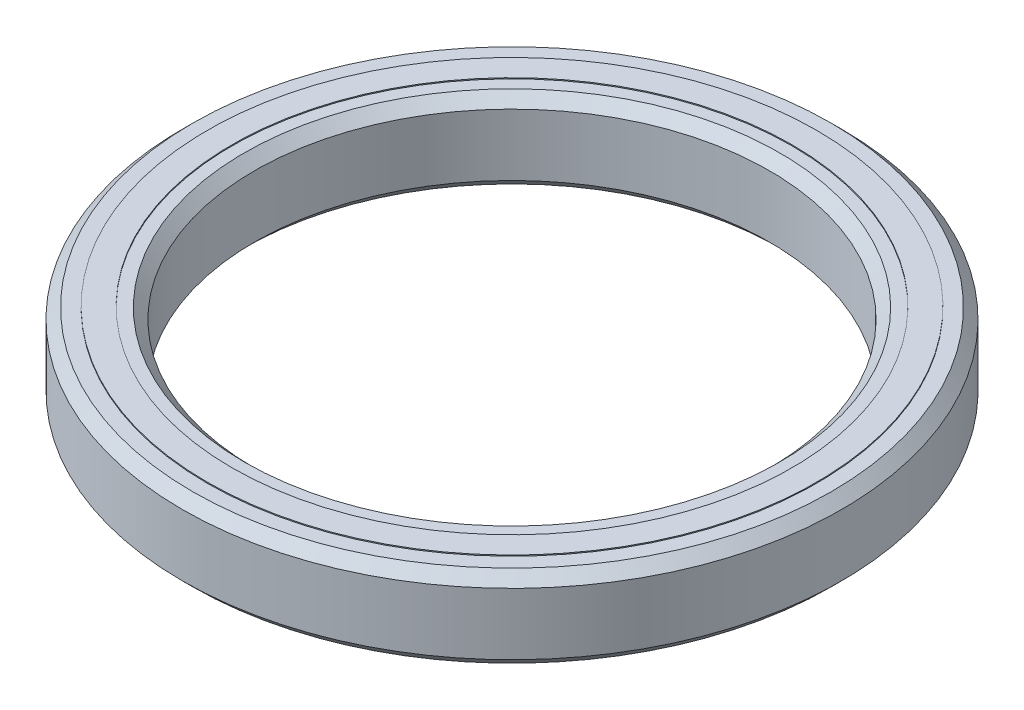
ISO-10303-21;
HEADER;
FILE_DESCRIPTION(('STEP AP214'),'2;1');
FILE_NAME('part.step','',(''),(''),'','','');
FILE_SCHEMA(('AUTOMOTIVE_DESIGN { 1 0 10303 214 1 1 1 1 }'));
ENDSEC;
DATA;
#1=APPLICATION_CONTEXT('core data for automotive mechanical design processes');
#2=APPLICATION_PROTOCOL_DEFINITION('international standard','automotive_design',2000,#1);
#3=PRODUCT_CONTEXT('',#1,'mechanical');
#4=PRODUCT('Part','Part','',(#3));
#5=PRODUCT_RELATED_PRODUCT_CATEGORY('part','',(#4));
#6=PRODUCT_DEFINITION_FORMATION('','',#4);
#7=PRODUCT_DEFINITION_CONTEXT('part definition',#1,'design');
#8=PRODUCT_DEFINITION('design','',#6,#7);
#9=PRODUCT_DEFINITION_SHAPE('','',#8);
#10=(LENGTH_UNIT() NAMED_UNIT(*) SI_UNIT(.MILLI.,.METRE.));
#11=(NAMED_UNIT(*) PLANE_ANGLE_UNIT() SI_UNIT($,.RADIAN.));
#12=(NAMED_UNIT(*) SI_UNIT($,.STERADIAN.) SOLID_ANGLE_UNIT());
#13=UNCERTAINTY_MEASURE_WITH_UNIT(LENGTH_MEASURE(1.E-05),#10,'distance_accuracy_value','');
#14=(GEOMETRIC_REPRESENTATION_CONTEXT(3) GLOBAL_UNCERTAINTY_ASSIGNED_CONTEXT((#13)) GLOBAL_UNIT_ASSIGNED_CONTEXT((#10,
#11,#12)) REPRESENTATION_CONTEXT('',''));
#15=CARTESIAN_POINT('',(0.,0.,0.));
#16=DIRECTION('',(0.,0.,1.));
#17=DIRECTION('',(1.,0.,0.));
#18=AXIS2_PLACEMENT_3D('',#15,#16,#17);
#19=CARTESIAN_POINT('',(0.,2.,0.));
#20=DIRECTION('',(0.,1.,0.));
#21=DIRECTION('',(0.,0.,1.));
#22=AXIS2_PLACEMENT_3D('',#19,#20,#21);
#23=PLANE('',#22);
#24=CARTESIAN_POINT('',(0.,2.,0.));
#25=DIRECTION('',(0.,1.,0.));
#26=DIRECTION('',(0.,0.,1.));
#27=AXIS2_PLACEMENT_3D('',#24,#25,#26);
#28=CIRCLE('',#27,14.7934604030925);
#29=CARTESIAN_POINT('',(0.,2.,14.7934604030925));
#30=VERTEX_POINT('',#29);
#31=EDGE_CURVE('E61',#30,#30,#28,.F.);
#32=ORIENTED_EDGE('',*,*,#31,.T.);
#33=EDGE_LOOP('',(#32));
#34=FACE_BOUND('',#33,.T.);
#35=CARTESIAN_POINT('',(0.,2.,0.));
#36=DIRECTION('',(0.,1.,0.));
#37=DIRECTION('',(0.,0.,1.));
#38=AXIS2_PLACEMENT_3D('',#35,#36,#37);
#39=CIRCLE('',#38,15.5);
#40=CARTESIAN_POINT('',(0.,2.,15.5));
#41=VERTEX_POINT('',#40);
#42=EDGE_CURVE('E82',#41,#41,#39,.T.);
#43=ORIENTED_EDGE('',*,*,#42,.T.);
#44=EDGE_LOOP('',(#43));
#45=FACE_BOUND('',#44,.T.);
#46=ADVANCED_FACE('F41',(#34,#45),#23,.T.);
#47=CARTESIAN_POINT('',(0.,-2.,0.));
#48=DIRECTION('',(0.,1.,0.));
#49=DIRECTION('',(0.,0.,1.));
#50=AXIS2_PLACEMENT_3D('',#47,#48,#49);
#51=PLANE('',#50);
#52=CARTESIAN_POINT('',(0.,-2.,0.));
#53=DIRECTION('',(0.,1.,0.));
#54=DIRECTION('',(0.,0.,1.));
#55=AXIS2_PLACEMENT_3D('',#52,#53,#54);
#56=CIRCLE('',#55,14.7934604030925);
#57=CARTESIAN_POINT('',(0.,-2.,14.7934604030925));
#58=VERTEX_POINT('',#57);
#59=EDGE_CURVE('E46',#58,#58,#56,.F.);
#60=ORIENTED_EDGE('',*,*,#59,.F.);
#61=EDGE_LOOP('',(#60));
#62=FACE_BOUND('',#61,.T.);
#63=CARTESIAN_POINT('',(0.,-2.,0.));
#64=DIRECTION('',(0.,1.,0.));
#65=DIRECTION('',(0.,0.,1.));
#66=AXIS2_PLACEMENT_3D('',#63,#64,#65);
#67=CIRCLE('',#66,15.5);
#68=CARTESIAN_POINT('',(0.,-2.,15.5));
#69=VERTEX_POINT('',#68);
#70=EDGE_CURVE('E65',#69,#69,#67,.F.);
#71=ORIENTED_EDGE('',*,*,#70,.T.);
#72=EDGE_LOOP('',(#71));
#73=FACE_BOUND('',#72,.T.);
#74=ADVANCED_FACE('F136',(#62,#73),#51,.F.);
#75=CARTESIAN_POINT('',(0.,2.,0.));
#76=DIRECTION('',(0.,-1.,0.));
#77=DIRECTION('',(0.,0.,-1.));
#78=AXIS2_PLACEMENT_3D('',#75,#76,#77);
#79=CYLINDRICAL_SURFACE('',#78,16.);
#80=CARTESIAN_POINT('',(0.,-1.49999999999999,0.));
#81=DIRECTION('',(0.,1.,0.));
#82=DIRECTION('',(0.,0.,1.));
#83=AXIS2_PLACEMENT_3D('',#80,#81,#82);
#84=CIRCLE('',#83,16.);
#85=CARTESIAN_POINT('',(0.,-1.49999999999999,16.));
#86=VERTEX_POINT('',#85);
#87=EDGE_CURVE('E56',#86,#86,#84,.T.);
#88=ORIENTED_EDGE('',*,*,#87,.T.);
#89=EDGE_LOOP('',(#88));
#90=FACE_BOUND('',#89,.T.);
#91=CARTESIAN_POINT('',(0.,1.49999999999999,0.));
#92=DIRECTION('',(0.,1.,0.));
#93=DIRECTION('',(0.,0.,1.));
#94=AXIS2_PLACEMENT_3D('',#91,#92,#93);
#95=CIRCLE('',#94,16.);
#96=CARTESIAN_POINT('',(0.,1.49999999999999,16.));
#97=VERTEX_POINT('',#96);
#98=EDGE_CURVE('E90',#97,#97,#95,.F.);
#99=ORIENTED_EDGE('',*,*,#98,.T.);
#100=EDGE_LOOP('',(#99));
#101=FACE_BOUND('',#100,.T.);
#102=ADVANCED_FACE('F143',(#90,#101),#79,.T.);
#103=CARTESIAN_POINT('',(0.,-1.49999999999999,0.));
#104=DIRECTION('',(0.,1.,0.));
#105=DIRECTION('',(0.,0.,1.));
#106=AXIS2_PLACEMENT_3D('',#103,#104,#105);
#107=CONICAL_SURFACE('',#106,16.,0.785398163397452);
#108=ORIENTED_EDGE('',*,*,#70,.F.);
#109=EDGE_LOOP('',(#108));
#110=FACE_BOUND('',#109,.T.);
#111=ORIENTED_EDGE('',*,*,#87,.F.);
#112=EDGE_LOOP('',(#111));
#113=FACE_BOUND('',#112,.T.);
#114=ADVANCED_FACE('F176',(#110,#113),#107,.T.);
#115=CARTESIAN_POINT('',(0.,2.,0.));
#116=DIRECTION('',(0.,-1.,0.));
#117=DIRECTION('',(0.,0.,-1.));
#118=AXIS2_PLACEMENT_3D('',#115,#116,#117);
#119=CONICAL_SURFACE('',#118,15.5,0.785398163397441);
#120=ORIENTED_EDGE('',*,*,#98,.F.);
#121=EDGE_LOOP('',(#120));
#122=FACE_BOUND('',#121,.T.);
#123=ORIENTED_EDGE('',*,*,#42,.F.);
#124=EDGE_LOOP('',(#123));
#125=FACE_BOUND('',#124,.T.);
#126=ADVANCED_FACE('F44',(#122,#125),#119,.T.);
#127=CARTESIAN_POINT('',(0.,2.05,0.));
#128=DIRECTION('',(0.,-1.,0.));
#129=DIRECTION('',(0.,0.,-1.));
#130=AXIS2_PLACEMENT_3D('',#127,#128,#129);
#131=CYLINDRICAL_SURFACE('',#130,14.7934604030925);
#132=CARTESIAN_POINT('',(0.,-2.05,0.));
#133=DIRECTION('',(0.,1.,0.));
#134=DIRECTION('',(0.,0.,1.));
#135=AXIS2_PLACEMENT_3D('',#132,#133,#134);
#136=CIRCLE('',#135,14.7934604030925);
#137=CARTESIAN_POINT('',(0.,-2.05,14.7934604030925));
#138=VERTEX_POINT('',#137);
#139=EDGE_CURVE('E59',#138,#138,#136,.T.);
#140=ORIENTED_EDGE('',*,*,#139,.T.);
#141=EDGE_LOOP('',(#140));
#142=FACE_BOUND('',#141,.T.);
#143=ORIENTED_EDGE('',*,*,#59,.T.);
#144=EDGE_LOOP('',(#143));
#145=FACE_BOUND('',#144,.T.);
#146=ADVANCED_FACE('F130',(#142,#145),#131,.T.);
#147=CARTESIAN_POINT('',(0.,-2.05,0.));
#148=DIRECTION('',(0.,1.,0.));
#149=DIRECTION('',(0.,0.,1.));
#150=AXIS2_PLACEMENT_3D('',#147,#148,#149);
#151=PLANE('',#150);
#152=ORIENTED_EDGE('',*,*,#139,.F.);
#153=EDGE_LOOP('',(#152));
#154=FACE_BOUND('',#153,.T.);
#155=CARTESIAN_POINT('',(0.,-2.05,0.));
#156=DIRECTION('',(0.,1.,0.));
#157=DIRECTION('',(0.,0.,1.));
#158=AXIS2_PLACEMENT_3D('',#155,#156,#157);
#159=CIRCLE('',#158,13.5904737587394);
#160=CARTESIAN_POINT('',(0.,-2.05,13.5904737587394));
#161=VERTEX_POINT('',#160);
#162=EDGE_CURVE('E109',#161,#161,#159,.T.);
#163=ORIENTED_EDGE('',*,*,#162,.T.);
#164=EDGE_LOOP('',(#163));
#165=FACE_BOUND('',#164,.T.);
#166=ADVANCED_FACE('F131',(#154,#165),#151,.F.);
#167=CARTESIAN_POINT('',(0.,2.05,0.));
#168=DIRECTION('',(0.,-1.,0.));
#169=DIRECTION('',(0.,0.,-1.));
#170=AXIS2_PLACEMENT_3D('',#167,#168,#169);
#171=CYLINDRICAL_SURFACE('',#170,13.5904737587394);
#172=ORIENTED_EDGE('',*,*,#162,.F.);
#173=EDGE_LOOP('',(#172));
#174=FACE_BOUND('',#173,.T.);
#175=CARTESIAN_POINT('',(0.,-2.,0.));
#176=DIRECTION('',(0.,1.,0.));
#177=DIRECTION('',(0.,0.,1.));
#178=AXIS2_PLACEMENT_3D('',#175,#176,#177);
#179=CIRCLE('',#178,13.5904737587394);
#180=CARTESIAN_POINT('',(0.,-2.,13.5904737587394));
#181=VERTEX_POINT('',#180);
#182=EDGE_CURVE('E66',#181,#181,#179,.F.);
#183=ORIENTED_EDGE('',*,*,#182,.F.);
#184=EDGE_LOOP('',(#183));
#185=FACE_BOUND('',#184,.T.);
#186=ADVANCED_FACE('F122',(#174,#185),#171,.F.);
#187=CARTESIAN_POINT('',(0.,2.05,0.));
#188=DIRECTION('',(0.,1.,0.));
#189=DIRECTION('',(0.,0.,1.));
#190=AXIS2_PLACEMENT_3D('',#187,#188,#189);
#191=PLANE('',#190);
#192=CARTESIAN_POINT('',(0.,2.05,0.));
#193=DIRECTION('',(0.,1.,0.));
#194=DIRECTION('',(0.,0.,1.));
#195=AXIS2_PLACEMENT_3D('',#192,#193,#194);
#196=CIRCLE('',#195,14.7934604030925);
#197=CARTESIAN_POINT('',(0.,2.05,14.7934604030925));
#198=VERTEX_POINT('',#197);
#199=EDGE_CURVE('E98',#198,#198,#196,.T.);
#200=ORIENTED_EDGE('',*,*,#199,.T.);
#201=EDGE_LOOP('',(#200));
#202=FACE_BOUND('',#201,.T.);
#203=CARTESIAN_POINT('',(0.,2.05,0.));
#204=DIRECTION('',(0.,1.,0.));
#205=DIRECTION('',(0.,0.,1.));
#206=AXIS2_PLACEMENT_3D('',#203,#204,#205);
#207=CIRCLE('',#206,13.5904737587394);
#208=CARTESIAN_POINT('',(0.,2.05,13.5904737587394));
#209=VERTEX_POINT('',#208);
#210=EDGE_CURVE('E107',#209,#209,#207,.T.);
#211=ORIENTED_EDGE('',*,*,#210,.F.);
#212=EDGE_LOOP('',(#211));
#213=FACE_BOUND('',#212,.T.);
#214=ADVANCED_FACE('F119',(#202,#213),#191,.T.);
#215=ORIENTED_EDGE('',*,*,#31,.F.);
#216=EDGE_LOOP('',(#215));
#217=FACE_BOUND('',#216,.T.);
#218=ORIENTED_EDGE('',*,*,#199,.F.);
#219=EDGE_LOOP('',(#218));
#220=FACE_BOUND('',#219,.T.);
#221=ADVANCED_FACE('F121',(#217,#220),#131,.T.);
#222=CARTESIAN_POINT('',(0.,2.,0.));
#223=DIRECTION('',(0.,1.,0.));
#224=DIRECTION('',(0.,0.,1.));
#225=AXIS2_PLACEMENT_3D('',#222,#223,#224);
#226=CIRCLE('',#225,13.5904737587394);
#227=CARTESIAN_POINT('',(0.,2.,13.5904737587394));
#228=VERTEX_POINT('',#227);
#229=EDGE_CURVE('E10',#228,#228,#226,.F.);
#230=ORIENTED_EDGE('',*,*,#229,.T.);
#231=EDGE_LOOP('',(#230));
#232=FACE_BOUND('',#231,.T.);
#233=ORIENTED_EDGE('',*,*,#210,.T.);
#234=EDGE_LOOP('',(#233));
#235=FACE_BOUND('',#234,.T.);
#236=ADVANCED_FACE('F117',(#232,#235),#171,.F.);
#237=CARTESIAN_POINT('',(0.,1.49999999999998,0.));
#238=DIRECTION('',(0.,1.,0.));
#239=DIRECTION('',(0.,0.,1.));
#240=AXIS2_PLACEMENT_3D('',#237,#238,#239);
#241=CONICAL_SURFACE('',#240,12.5,0.785398163397453);
#242=CARTESIAN_POINT('',(0.,2.,0.));
#243=DIRECTION('',(0.,1.,0.));
#244=DIRECTION('',(0.,0.,1.));
#245=AXIS2_PLACEMENT_3D('',#242,#243,#244);
#246=CIRCLE('',#245,13.);
#247=CARTESIAN_POINT('',(0.,2.,13.));
#248=VERTEX_POINT('',#247);
#249=EDGE_CURVE('E86',#248,#248,#246,.F.);
#250=CARTESIAN_POINT('',(0.,1.49999999999998,0.));
#251=DIRECTION('',(0.,1.,0.));
#252=DIRECTION('',(0.,0.,1.));
#253=AXIS2_PLACEMENT_3D('',#250,#251,#252);
#254=CIRCLE('',#253,12.5);
#255=CARTESIAN_POINT('',(0.,1.49999999999998,12.5));
#256=VERTEX_POINT('',#255);
#257=EDGE_CURVE('E74',#256,#256,#254,.T.);
#258=CARTESIAN_POINT('',(0.,2.,13.));
#259=CARTESIAN_POINT('',(0.,1.99479166666667,12.9947916666667));
#260=CARTESIAN_POINT('',(0.,1.98958333333333,12.9895833333334));
#261=CARTESIAN_POINT('',(0.,1.97916666666667,12.9791666666667));
#262=CARTESIAN_POINT('',(0.,1.97395833333333,12.9739583333334));
#263=CARTESIAN_POINT('',(0.,1.96354166666667,12.9635416666667));
#264=CARTESIAN_POINT('',(0.,1.95833333333333,12.9583333333334));
#265=CARTESIAN_POINT('',(0.,1.94791666666666,12.9479166666667));
#266=CARTESIAN_POINT('',(0.,1.94270833333333,12.9427083333334));
#267=CARTESIAN_POINT('',(0.,1.93229166666666,12.9322916666667));
#268=CARTESIAN_POINT('',(0.,1.92708333333333,12.9270833333334));
#269=CARTESIAN_POINT('',(0.,1.91666666666666,12.9166666666667));
#270=CARTESIAN_POINT('',(0.,1.91145833333333,12.9114583333334));
#271=CARTESIAN_POINT('',(0.,1.90104166666666,12.9010416666667));
#272=CARTESIAN_POINT('',(0.,1.89583333333333,12.8958333333334));
#273=CARTESIAN_POINT('',(0.,1.88541666666666,12.8854166666667));
#274=CARTESIAN_POINT('',(0.,1.88020833333333,12.8802083333334));
#275=CARTESIAN_POINT('',(0.,1.86979166666666,12.8697916666667));
#276=CARTESIAN_POINT('',(0.,1.86458333333333,12.8645833333334));
#277=CARTESIAN_POINT('',(0.,1.85416666666666,12.8541666666667));
#278=CARTESIAN_POINT('',(0.,1.84895833333333,12.8489583333334));
#279=CARTESIAN_POINT('',(0.,1.83854166666666,12.8385416666667));
#280=CARTESIAN_POINT('',(0.,1.83333333333333,12.8333333333334));
#281=CARTESIAN_POINT('',(0.,1.82291666666666,12.8229166666667));
#282=CARTESIAN_POINT('',(0.,1.81770833333333,12.8177083333333));
#283=CARTESIAN_POINT('',(0.,1.80729166666666,12.8072916666667));
#284=CARTESIAN_POINT('',(0.,1.80208333333333,12.8020833333333));
#285=CARTESIAN_POINT('',(0.,1.79166666666666,12.7916666666667));
#286=CARTESIAN_POINT('',(0.,1.78645833333332,12.7864583333333));
#287=CARTESIAN_POINT('',(0.,1.77604166666666,12.7760416666667));
#288=CARTESIAN_POINT('',(0.,1.77083333333332,12.7708333333333));
#289=CARTESIAN_POINT('',(0.,1.76041666666666,12.7604166666667));
#290=CARTESIAN_POINT('',(0.,1.75520833333332,12.7552083333333));
#291=CARTESIAN_POINT('',(0.,1.74479166666666,12.7447916666667));
#292=CARTESIAN_POINT('',(0.,1.73958333333332,12.7395833333333));
#293=CARTESIAN_POINT('',(0.,1.72916666666666,12.7291666666667));
#294=CARTESIAN_POINT('',(0.,1.72395833333332,12.7239583333333));
#295=CARTESIAN_POINT('',(0.,1.71354166666666,12.7135416666667));
#296=CARTESIAN_POINT('',(0.,1.70833333333332,12.7083333333333));
#297=CARTESIAN_POINT('',(0.,1.69791666666665,12.6979166666667));
#298=CARTESIAN_POINT('',(0.,1.69270833333332,12.6927083333333));
#299=CARTESIAN_POINT('',(0.,1.68229166666665,12.6822916666667));
#300=CARTESIAN_POINT('',(0.,1.67708333333332,12.6770833333333));
#301=CARTESIAN_POINT('',(0.,1.66666666666665,12.6666666666667));
#302=CARTESIAN_POINT('',(0.,1.66145833333332,12.6614583333333));
#303=CARTESIAN_POINT('',(0.,1.65104166666665,12.6510416666667));
#304=CARTESIAN_POINT('',(0.,1.64583333333332,12.6458333333333));
#305=CARTESIAN_POINT('',(0.,1.63541666666665,12.6354166666667));
#306=CARTESIAN_POINT('',(0.,1.63020833333332,12.6302083333333));
#307=CARTESIAN_POINT('',(0.,1.61979166666665,12.6197916666667));
#308=CARTESIAN_POINT('',(0.,1.61458333333332,12.6145833333333));
#309=CARTESIAN_POINT('',(0.,1.60416666666665,12.6041666666667));
#310=CARTESIAN_POINT('',(0.,1.59895833333332,12.5989583333333));
#311=CARTESIAN_POINT('',(0.,1.58854166666665,12.5885416666667));
#312=CARTESIAN_POINT('',(0.,1.58333333333332,12.5833333333333));
#313=CARTESIAN_POINT('',(0.,1.57291666666665,12.5729166666667));
#314=CARTESIAN_POINT('',(0.,1.56770833333332,12.5677083333333));
#315=CARTESIAN_POINT('',(0.,1.55729166666665,12.5572916666667));
#316=CARTESIAN_POINT('',(0.,1.55208333333332,12.5520833333333));
#317=CARTESIAN_POINT('',(0.,1.54166666666665,12.5416666666667));
#318=CARTESIAN_POINT('',(0.,1.53645833333332,12.5364583333333));
#319=CARTESIAN_POINT('',(0.,1.52604166666665,12.5260416666667));
#320=CARTESIAN_POINT('',(0.,1.52083333333331,12.5208333333333));
#321=CARTESIAN_POINT('',(0.,1.51041666666665,12.5104166666667));
#322=CARTESIAN_POINT('',(0.,1.50520833333331,12.5052083333333));
#323=CARTESIAN_POINT('',(0.,1.49999999999998,12.5));
#324=B_SPLINE_CURVE_WITH_KNOTS('',3,(#258,#259,#260,#261,#262,#263,#264,#265,#266,#267,#268,
#269,#270,#271,#272,#273,#274,#275,#276,#277,#278,#279,#280,#281,#282,#283,#284,#285,#286,#287,
#288,#289,#290,#291,#292,#293,#294,#295,#296,#297,#298,#299,#300,#301,#302,#303,#304,#305,#306,
#307,#308,#309,#310,#311,#312,#313,#314,#315,#316,#317,#318,#319,#320,#321,#322,#323),
.UNSPECIFIED.,.F.,.F.,(4,2,2,2,2,2,2,2,2,2,2,2,2,2,2,2,2,2,2,2,2,2,2,2,2,2,2,2,2,2,2,2,4),(0.,
0.0220970869120812,0.0441941738241611,0.0662912607362413,0.0883883476483225,0.110485434560403,
0.132582521472484,0.154679608384564,0.176776695296645,0.198873782208725,0.220970869120805,
0.243067956032887,0.265165042944967,0.287262129857048,0.309359216769128,0.331456303681209,
0.353553390593289,0.375650477505371,0.39774756441745,0.419844651329531,0.441941738241612,
0.464038825153692,0.486135912065773,0.508232998977853,0.530330085889934,0.552427172802014,
0.574524259714094,0.596621346626176,0.618718433538256,0.640815520450337,0.662912607362417,
0.685009694274498,0.707106781186578),.UNSPECIFIED.);
#325=EDGE_CURVE('BSEAM151',#248,#256,#324,.T.);
#326=ORIENTED_EDGE('',*,*,#249,.F.);
#327=ORIENTED_EDGE('',*,*,#257,.F.);
#328=ORIENTED_EDGE('',*,*,#325,.T.);
#329=ORIENTED_EDGE('',*,*,#325,.F.);
#330=EDGE_LOOP('',(#326,#328,#327,#329));
#331=FACE_BOUND('',#330,.T.);
#332=ADVANCED_FACE('F151',(#331),#241,.F.);
#333=ORIENTED_EDGE('',*,*,#249,.T.);
#334=EDGE_LOOP('',(#333));
#335=FACE_BOUND('',#334,.T.);
#336=ORIENTED_EDGE('',*,*,#229,.F.);
#337=EDGE_LOOP('',(#336));
#338=FACE_BOUND('',#337,.T.);
#339=ADVANCED_FACE('F139',(#335,#338),#23,.T.);
#340=CARTESIAN_POINT('',(0.,2.,0.));
#341=DIRECTION('',(0.,-1.,0.));
#342=DIRECTION('',(0.,0.,-1.));
#343=AXIS2_PLACEMENT_3D('',#340,#341,#342);
#344=CYLINDRICAL_SURFACE('',#343,12.5);
#345=CARTESIAN_POINT('',(0.,-1.5,0.));
#346=DIRECTION('',(0.,1.,0.));
#347=DIRECTION('',(0.,0.,1.));
#348=AXIS2_PLACEMENT_3D('',#345,#346,#347);
#349=CIRCLE('',#348,12.5);
#350=CARTESIAN_POINT('',(0.,-1.5,12.5));
#351=VERTEX_POINT('',#350);
#352=EDGE_CURVE('E78',#351,#351,#349,.F.);
#353=ORIENTED_EDGE('',*,*,#352,.T.);
#354=EDGE_LOOP('',(#353));
#355=FACE_BOUND('',#354,.T.);
#356=ORIENTED_EDGE('',*,*,#257,.T.);
#357=EDGE_LOOP('',(#356));
#358=FACE_BOUND('',#357,.T.);
#359=ADVANCED_FACE('F150',(#355,#358),#344,.F.);
#360=CARTESIAN_POINT('',(0.,-2.,0.));
#361=DIRECTION('',(0.,-1.,0.));
#362=DIRECTION('',(0.,0.,-1.));
#363=AXIS2_PLACEMENT_3D('',#360,#361,#362);
#364=CONICAL_SURFACE('',#363,13.,0.78539816339744);
#365=ORIENTED_EDGE('',*,*,#352,.F.);
#366=EDGE_LOOP('',(#365));
#367=FACE_BOUND('',#366,.T.);
#368=CARTESIAN_POINT('',(0.,-2.,0.));
#369=DIRECTION('',(0.,1.,0.));
#370=DIRECTION('',(0.,0.,1.));
#371=AXIS2_PLACEMENT_3D('',#368,#369,#370);
#372=CIRCLE('',#371,13.);
#373=CARTESIAN_POINT('',(0.,-2.,13.));
#374=VERTEX_POINT('',#373);
#375=EDGE_CURVE('E70',#374,#374,#372,.T.);
#376=ORIENTED_EDGE('',*,*,#375,.F.);
#377=EDGE_LOOP('',(#376));
#378=FACE_BOUND('',#377,.T.);
#379=ADVANCED_FACE('F157',(#367,#378),#364,.F.);
#380=ORIENTED_EDGE('',*,*,#375,.T.);
#381=EDGE_LOOP('',(#380));
#382=FACE_BOUND('',#381,.T.);
#383=ORIENTED_EDGE('',*,*,#182,.T.);
#384=EDGE_LOOP('',(#383));
#385=FACE_BOUND('',#384,.T.);
#386=ADVANCED_FACE('F146',(#382,#385),#51,.F.);
#387=CLOSED_SHELL('',(#46,#74,#102,#114,#126,#146,#166,#186,#214,#221,#236,#332,#339,#359,#379,#386));
#388=MANIFOLD_SOLID_BREP('B2',#387);
#389=ADVANCED_BREP_SHAPE_REPRESENTATION('',(#18,#388),#14);
#390=SHAPE_DEFINITION_REPRESENTATION(#9,#389);
ENDSEC;
END-ISO-10303-21;
